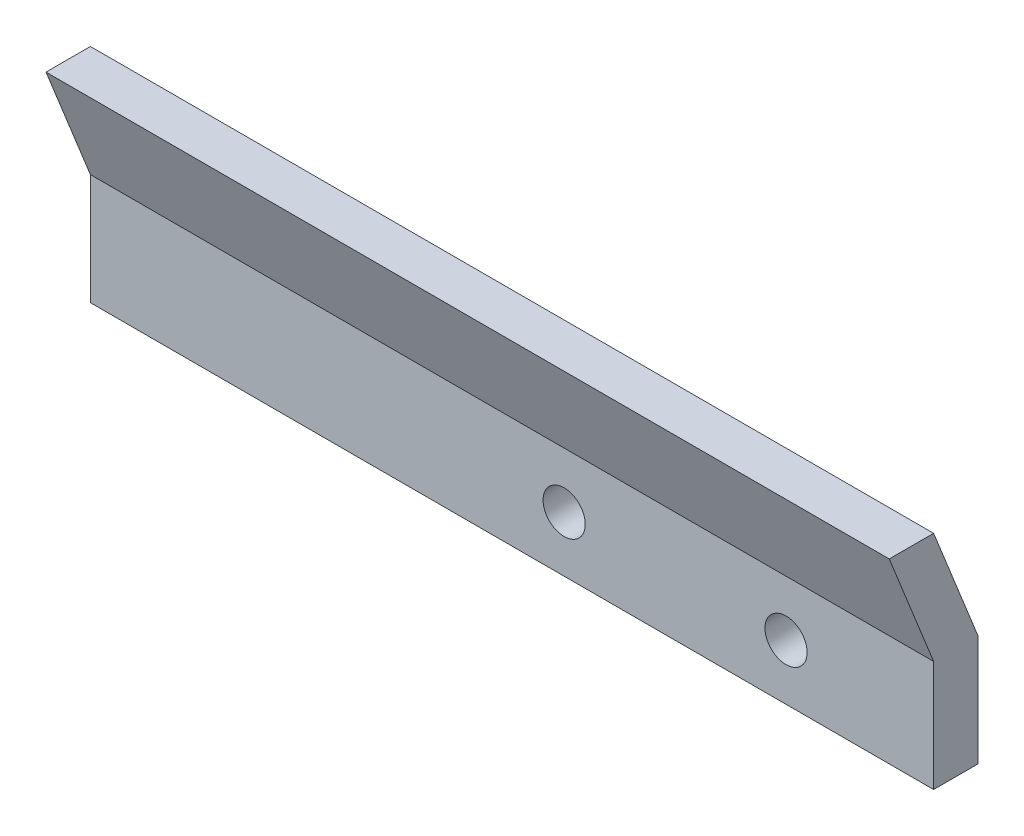
ISO-10303-21;
HEADER;
FILE_DESCRIPTION(('STEP AP214'),'2;1');
FILE_NAME('part.step','',(''),(''),'','','');
FILE_SCHEMA(('AUTOMOTIVE_DESIGN { 1 0 10303 214 1 1 1 1 }'));
ENDSEC;
DATA;
#1=APPLICATION_CONTEXT('core data for automotive mechanical design processes');
#2=APPLICATION_PROTOCOL_DEFINITION('international standard','automotive_design',2000,#1);
#3=PRODUCT_CONTEXT('',#1,'mechanical');
#4=PRODUCT('Part','Part','',(#3));
#5=PRODUCT_RELATED_PRODUCT_CATEGORY('part','',(#4));
#6=PRODUCT_DEFINITION_FORMATION('','',#4);
#7=PRODUCT_DEFINITION_CONTEXT('part definition',#1,'design');
#8=PRODUCT_DEFINITION('design','',#6,#7);
#9=PRODUCT_DEFINITION_SHAPE('','',#8);
#10=(LENGTH_UNIT() NAMED_UNIT(*) SI_UNIT(.MILLI.,.METRE.));
#11=(NAMED_UNIT(*) PLANE_ANGLE_UNIT() SI_UNIT($,.RADIAN.));
#12=(NAMED_UNIT(*) SI_UNIT($,.STERADIAN.) SOLID_ANGLE_UNIT());
#13=UNCERTAINTY_MEASURE_WITH_UNIT(LENGTH_MEASURE(1.E-05),#10,'distance_accuracy_value','');
#14=(GEOMETRIC_REPRESENTATION_CONTEXT(3) GLOBAL_UNCERTAINTY_ASSIGNED_CONTEXT((#13)) GLOBAL_UNIT_ASSIGNED_CONTEXT((#10,
#11,#12)) REPRESENTATION_CONTEXT('',''));
#15=CARTESIAN_POINT('',(0.,0.,0.));
#16=DIRECTION('',(0.,0.,1.));
#17=DIRECTION('',(1.,0.,0.));
#18=AXIS2_PLACEMENT_3D('',#15,#16,#17);
#19=CARTESIAN_POINT('',(0.,0.,2.));
#20=DIRECTION('',(0.,0.,1.));
#21=DIRECTION('',(1.,0.,0.));
#22=AXIS2_PLACEMENT_3D('',#19,#20,#21);
#23=PLANE('',#22);
#24=CARTESIAN_POINT('',(21.35,-2.5,2.));
#25=DIRECTION('',(0.,0.,1.));
#26=DIRECTION('',(1.,0.,0.));
#27=AXIS2_PLACEMENT_3D('',#24,#25,#26);
#28=CIRCLE('',#27,0.950000000000001);
#29=CARTESIAN_POINT('',(22.3,-2.5,2.));
#30=VERTEX_POINT('',#29);
#31=EDGE_CURVE('E127',#30,#30,#28,.T.);
#32=ORIENTED_EDGE('',*,*,#31,.F.);
#33=EDGE_LOOP('',(#32));
#34=FACE_BOUND('',#33,.T.);
#35=DIRECTION('',(0.,-1.,0.));
#36=VECTOR('',#35,1.);
#37=CARTESIAN_POINT('',(0.,0.,2.));
#38=LINE('',#37,#36);
#39=CARTESIAN_POINT('',(0.,0.,2.));
#40=VERTEX_POINT('',#39);
#41=CARTESIAN_POINT('',(0.,-5.,2.));
#42=VERTEX_POINT('',#41);
#43=EDGE_CURVE('E140',#40,#42,#38,.T.);
#44=ORIENTED_EDGE('',*,*,#43,.T.);
#45=DIRECTION('',(1.,0.,0.));
#46=VECTOR('',#45,1.);
#47=CARTESIAN_POINT('',(0.,-5.,2.));
#48=LINE('',#47,#46);
#49=CARTESIAN_POINT('',(38.,-5.,2.));
#50=VERTEX_POINT('',#49);
#51=EDGE_CURVE('E84',#42,#50,#48,.T.);
#52=ORIENTED_EDGE('',*,*,#51,.T.);
#53=DIRECTION('',(0.,1.,0.));
#54=VECTOR('',#53,1.);
#55=CARTESIAN_POINT('',(38.,0.,2.));
#56=LINE('',#55,#54);
#57=CARTESIAN_POINT('',(38.,0.,2.));
#58=VERTEX_POINT('',#57);
#59=EDGE_CURVE('E143',#50,#58,#56,.T.);
#60=ORIENTED_EDGE('',*,*,#59,.T.);
#61=DIRECTION('',(-1.,0.,0.));
#62=VECTOR('',#61,1.);
#63=CARTESIAN_POINT('',(0.,0.,2.));
#64=LINE('',#63,#62);
#65=EDGE_CURVE('E59',#58,#40,#64,.T.);
#66=ORIENTED_EDGE('',*,*,#65,.T.);
#67=EDGE_LOOP('',(#44,#52,#60,#66));
#68=FACE_BOUND('',#67,.T.);
#69=CARTESIAN_POINT('',(31.35,-2.5,2.));
#70=DIRECTION('',(0.,0.,1.));
#71=DIRECTION('',(1.,0.,0.));
#72=AXIS2_PLACEMENT_3D('',#69,#70,#71);
#73=CIRCLE('',#72,0.950000000000001);
#74=CARTESIAN_POINT('',(32.3,-2.5,2.));
#75=VERTEX_POINT('',#74);
#76=EDGE_CURVE('E135',#75,#75,#73,.T.);
#77=ORIENTED_EDGE('',*,*,#76,.F.);
#78=EDGE_LOOP('',(#77));
#79=FACE_BOUND('',#78,.T.);
#80=ADVANCED_FACE('F41',(#34,#68,#79),#23,.T.);
#81=CARTESIAN_POINT('',(0.,0.,0.));
#82=DIRECTION('',(0.,0.,1.));
#83=DIRECTION('',(1.,0.,0.));
#84=AXIS2_PLACEMENT_3D('',#81,#82,#83);
#85=PLANE('',#84);
#86=CARTESIAN_POINT('',(21.35,-2.5,0.));
#87=DIRECTION('',(0.,0.,1.));
#88=DIRECTION('',(1.,0.,0.));
#89=AXIS2_PLACEMENT_3D('',#86,#87,#88);
#90=CIRCLE('',#89,0.950000000000001);
#91=CARTESIAN_POINT('',(22.3,-2.5,0.));
#92=VERTEX_POINT('',#91);
#93=EDGE_CURVE('E45',#92,#92,#90,.T.);
#94=ORIENTED_EDGE('',*,*,#93,.T.);
#95=EDGE_LOOP('',(#94));
#96=FACE_BOUND('',#95,.T.);
#97=DIRECTION('',(0.,-1.,0.));
#98=VECTOR('',#97,1.);
#99=CARTESIAN_POINT('',(0.,0.,0.));
#100=LINE('',#99,#98);
#101=CARTESIAN_POINT('',(0.,0.,0.));
#102=VERTEX_POINT('',#101);
#103=CARTESIAN_POINT('',(0.,-5.,0.));
#104=VERTEX_POINT('',#103);
#105=EDGE_CURVE('E79',#102,#104,#100,.T.);
#106=ORIENTED_EDGE('',*,*,#105,.F.);
#107=DIRECTION('',(-1.,0.,0.));
#108=VECTOR('',#107,1.);
#109=CARTESIAN_POINT('',(0.,0.,0.));
#110=LINE('',#109,#108);
#111=CARTESIAN_POINT('',(38.,0.,0.));
#112=VERTEX_POINT('',#111);
#113=EDGE_CURVE('E121',#112,#102,#110,.T.);
#114=ORIENTED_EDGE('',*,*,#113,.F.);
#115=DIRECTION('',(0.,1.,0.));
#116=VECTOR('',#115,1.);
#117=CARTESIAN_POINT('',(38.,0.,0.));
#118=LINE('',#117,#116);
#119=CARTESIAN_POINT('',(38.,-5.,0.));
#120=VERTEX_POINT('',#119);
#121=EDGE_CURVE('E148',#120,#112,#118,.T.);
#122=ORIENTED_EDGE('',*,*,#121,.F.);
#123=DIRECTION('',(1.,0.,0.));
#124=VECTOR('',#123,1.);
#125=CARTESIAN_POINT('',(0.,-5.,0.));
#126=LINE('',#125,#124);
#127=EDGE_CURVE('E72',#104,#120,#126,.T.);
#128=ORIENTED_EDGE('',*,*,#127,.F.);
#129=EDGE_LOOP('',(#106,#114,#122,#128));
#130=FACE_BOUND('',#129,.T.);
#131=CARTESIAN_POINT('',(31.35,-2.5,0.));
#132=DIRECTION('',(0.,0.,1.));
#133=DIRECTION('',(1.,0.,0.));
#134=AXIS2_PLACEMENT_3D('',#131,#132,#133);
#135=CIRCLE('',#134,0.950000000000001);
#136=CARTESIAN_POINT('',(32.3,-2.5,0.));
#137=VERTEX_POINT('',#136);
#138=EDGE_CURVE('E133',#137,#137,#135,.T.);
#139=ORIENTED_EDGE('',*,*,#138,.T.);
#140=EDGE_LOOP('',(#139));
#141=FACE_BOUND('',#140,.T.);
#142=ADVANCED_FACE('F156',(#96,#130,#141),#85,.F.);
#143=CARTESIAN_POINT('',(0.,0.,2.));
#144=DIRECTION('',(1.,0.,0.));
#145=DIRECTION('',(0.,0.,-1.));
#146=AXIS2_PLACEMENT_3D('',#143,#144,#145);
#147=PLANE('',#146);
#148=ORIENTED_EDGE('',*,*,#105,.T.);
#149=DIRECTION('',(0.,0.,-1.));
#150=VECTOR('',#149,1.);
#151=CARTESIAN_POINT('',(0.,-5.,2.));
#152=LINE('',#151,#150);
#153=EDGE_CURVE('E11',#42,#104,#152,.T.);
#154=ORIENTED_EDGE('',*,*,#153,.F.);
#155=ORIENTED_EDGE('',*,*,#43,.F.);
#156=DIRECTION('',(0.,-0.928476690885259,-0.371390676354104));
#157=VECTOR('',#156,1.);
#158=CARTESIAN_POINT('',(0.,5.,4.));
#159=LINE('',#158,#157);
#160=CARTESIAN_POINT('',(0.,5.,4.));
#161=VERTEX_POINT('',#160);
#162=EDGE_CURVE('E113',#161,#40,#159,.T.);
#163=ORIENTED_EDGE('',*,*,#162,.F.);
#164=DIRECTION('',(0.,0.,1.));
#165=VECTOR('',#164,1.);
#166=CARTESIAN_POINT('',(0.,5.,2.));
#167=LINE('',#166,#165);
#168=CARTESIAN_POINT('',(0.,5.,2.));
#169=VERTEX_POINT('',#168);
#170=EDGE_CURVE('E104',#169,#161,#167,.T.);
#171=ORIENTED_EDGE('',*,*,#170,.F.);
#172=DIRECTION('',(0.,0.928476690885259,0.371390676354104));
#173=VECTOR('',#172,1.);
#174=CARTESIAN_POINT('',(0.,0.,0.));
#175=LINE('',#174,#173);
#176=EDGE_CURVE('E117',#102,#169,#175,.T.);
#177=ORIENTED_EDGE('',*,*,#176,.F.);
#178=EDGE_LOOP('',(#148,#154,#155,#163,#171,#177));
#179=FACE_BOUND('',#178,.T.);
#180=ADVANCED_FACE('F43',(#179),#147,.F.);
#181=CARTESIAN_POINT('',(0.,-5.,2.));
#182=DIRECTION('',(0.,1.,0.));
#183=DIRECTION('',(0.,0.,1.));
#184=AXIS2_PLACEMENT_3D('',#181,#182,#183);
#185=PLANE('',#184);
#186=ORIENTED_EDGE('',*,*,#127,.T.);
#187=DIRECTION('',(0.,0.,-1.));
#188=VECTOR('',#187,1.);
#189=CARTESIAN_POINT('',(38.,-5.,2.));
#190=LINE('',#189,#188);
#191=EDGE_CURVE('E51',#50,#120,#190,.T.);
#192=ORIENTED_EDGE('',*,*,#191,.F.);
#193=ORIENTED_EDGE('',*,*,#51,.F.);
#194=ORIENTED_EDGE('',*,*,#153,.T.);
#195=EDGE_LOOP('',(#186,#192,#193,#194));
#196=FACE_BOUND('',#195,.T.);
#197=ADVANCED_FACE('F159',(#196),#185,.F.);
#198=CARTESIAN_POINT('',(38.,0.,2.));
#199=DIRECTION('',(-1.,0.,0.));
#200=DIRECTION('',(0.,0.,1.));
#201=AXIS2_PLACEMENT_3D('',#198,#199,#200);
#202=PLANE('',#201);
#203=ORIENTED_EDGE('',*,*,#121,.T.);
#204=DIRECTION('',(0.,0.928476690885259,0.371390676354104));
#205=VECTOR('',#204,1.);
#206=CARTESIAN_POINT('',(38.,0.,0.));
#207=LINE('',#206,#205);
#208=CARTESIAN_POINT('',(38.,5.,2.));
#209=VERTEX_POINT('',#208);
#210=EDGE_CURVE('E130',#112,#209,#207,.T.);
#211=ORIENTED_EDGE('',*,*,#210,.T.);
#212=DIRECTION('',(0.,0.,1.));
#213=VECTOR('',#212,1.);
#214=CARTESIAN_POINT('',(38.,5.,2.));
#215=LINE('',#214,#213);
#216=CARTESIAN_POINT('',(38.,5.,4.));
#217=VERTEX_POINT('',#216);
#218=EDGE_CURVE('E107',#209,#217,#215,.T.);
#219=ORIENTED_EDGE('',*,*,#218,.T.);
#220=DIRECTION('',(0.,-0.928476690885259,-0.371390676354104));
#221=VECTOR('',#220,1.);
#222=CARTESIAN_POINT('',(38.,5.,4.));
#223=LINE('',#222,#221);
#224=EDGE_CURVE('E122',#217,#58,#223,.T.);
#225=ORIENTED_EDGE('',*,*,#224,.T.);
#226=ORIENTED_EDGE('',*,*,#59,.F.);
#227=ORIENTED_EDGE('',*,*,#191,.T.);
#228=EDGE_LOOP('',(#203,#211,#219,#225,#226,#227));
#229=FACE_BOUND('',#228,.T.);
#230=ADVANCED_FACE('F155',(#229),#202,.F.);
#231=CARTESIAN_POINT('',(31.35,-2.5,2.));
#232=DIRECTION('',(0.,0.,-1.));
#233=DIRECTION('',(-1.,0.,0.));
#234=AXIS2_PLACEMENT_3D('',#231,#232,#233);
#235=CYLINDRICAL_SURFACE('',#234,0.950000000000001);
#236=ORIENTED_EDGE('',*,*,#76,.T.);
#237=EDGE_LOOP('',(#236));
#238=FACE_BOUND('',#237,.T.);
#239=ORIENTED_EDGE('',*,*,#138,.F.);
#240=EDGE_LOOP('',(#239));
#241=FACE_BOUND('',#240,.T.);
#242=ADVANCED_FACE('F164',(#238,#241),#235,.F.);
#243=CARTESIAN_POINT('',(0.,5.,4.));
#244=DIRECTION('',(0.,-0.371390676354104,0.928476690885259));
#245=DIRECTION('',(0.,-0.928476690885259,-0.371390676354104));
#246=AXIS2_PLACEMENT_3D('',#243,#244,#245);
#247=PLANE('',#246);
#248=ORIENTED_EDGE('',*,*,#224,.F.);
#249=DIRECTION('',(1.,0.,0.));
#250=VECTOR('',#249,1.);
#251=CARTESIAN_POINT('',(0.,5.,4.));
#252=LINE('',#251,#250);
#253=EDGE_CURVE('E112',#161,#217,#252,.T.);
#254=ORIENTED_EDGE('',*,*,#253,.F.);
#255=ORIENTED_EDGE('',*,*,#162,.T.);
#256=ORIENTED_EDGE('',*,*,#65,.F.);
#257=EDGE_LOOP('',(#248,#254,#255,#256));
#258=FACE_BOUND('',#257,.T.);
#259=ADVANCED_FACE('F162',(#258),#247,.T.);
#260=CARTESIAN_POINT('',(0.,5.,2.));
#261=DIRECTION('',(0.,1.,0.));
#262=DIRECTION('',(0.,0.,1.));
#263=AXIS2_PLACEMENT_3D('',#260,#261,#262);
#264=PLANE('',#263);
#265=ORIENTED_EDGE('',*,*,#218,.F.);
#266=DIRECTION('',(1.,0.,0.));
#267=VECTOR('',#266,1.);
#268=CARTESIAN_POINT('',(0.,5.,2.));
#269=LINE('',#268,#267);
#270=EDGE_CURVE('E101',#169,#209,#269,.T.);
#271=ORIENTED_EDGE('',*,*,#270,.F.);
#272=ORIENTED_EDGE('',*,*,#170,.T.);
#273=ORIENTED_EDGE('',*,*,#253,.T.);
#274=EDGE_LOOP('',(#265,#271,#272,#273));
#275=FACE_BOUND('',#274,.T.);
#276=ADVANCED_FACE('F103',(#275),#264,.T.);
#277=CARTESIAN_POINT('',(0.,0.,0.));
#278=DIRECTION('',(0.,0.371390676354104,-0.928476690885259));
#279=DIRECTION('',(0.,0.928476690885259,0.371390676354104));
#280=AXIS2_PLACEMENT_3D('',#277,#278,#279);
#281=PLANE('',#280);
#282=ORIENTED_EDGE('',*,*,#210,.F.);
#283=ORIENTED_EDGE('',*,*,#113,.T.);
#284=ORIENTED_EDGE('',*,*,#176,.T.);
#285=ORIENTED_EDGE('',*,*,#270,.T.);
#286=EDGE_LOOP('',(#282,#283,#284,#285));
#287=FACE_BOUND('',#286,.T.);
#288=ADVANCED_FACE('F120',(#287),#281,.T.);
#289=CARTESIAN_POINT('',(21.35,-2.5,-10.));
#290=DIRECTION('',(0.,0.,1.));
#291=DIRECTION('',(1.,0.,0.));
#292=AXIS2_PLACEMENT_3D('',#289,#290,#291);
#293=CYLINDRICAL_SURFACE('',#292,0.950000000000001);
#294=ORIENTED_EDGE('',*,*,#31,.T.);
#295=EDGE_LOOP('',(#294));
#296=FACE_BOUND('',#295,.T.);
#297=ORIENTED_EDGE('',*,*,#93,.F.);
#298=EDGE_LOOP('',(#297));
#299=FACE_BOUND('',#298,.T.);
#300=ADVANCED_FACE('F222',(#296,#299),#293,.F.);
#301=CLOSED_SHELL('',(#80,#142,#180,#197,#230,#242,#259,#276,#288,#300));
#302=MANIFOLD_SOLID_BREP('B2',#301);
#303=ADVANCED_BREP_SHAPE_REPRESENTATION('',(#18,#302),#14);
#304=SHAPE_DEFINITION_REPRESENTATION(#9,#303);
ENDSEC;
END-ISO-10303-21;
